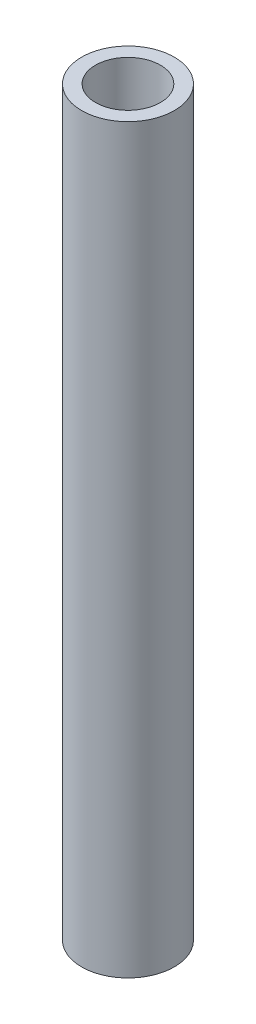
ISO-10303-21;
HEADER;
FILE_DESCRIPTION(('STEP AP214'),'2;1');
FILE_NAME('part.step','',(''),(''),'','','');
FILE_SCHEMA(('AUTOMOTIVE_DESIGN { 1 0 10303 214 1 1 1 1 }'));
ENDSEC;
DATA;
#1=APPLICATION_CONTEXT('core data for automotive mechanical design processes');
#2=APPLICATION_PROTOCOL_DEFINITION('international standard','automotive_design',2000,#1);
#3=PRODUCT_CONTEXT('',#1,'mechanical');
#4=PRODUCT('Part','Part','',(#3));
#5=PRODUCT_RELATED_PRODUCT_CATEGORY('part','',(#4));
#6=PRODUCT_DEFINITION_FORMATION('','',#4);
#7=PRODUCT_DEFINITION_CONTEXT('part definition',#1,'design');
#8=PRODUCT_DEFINITION('design','',#6,#7);
#9=PRODUCT_DEFINITION_SHAPE('','',#8);
#10=(LENGTH_UNIT() NAMED_UNIT(*) SI_UNIT(.MILLI.,.METRE.));
#11=(NAMED_UNIT(*) PLANE_ANGLE_UNIT() SI_UNIT($,.RADIAN.));
#12=(NAMED_UNIT(*) SI_UNIT($,.STERADIAN.) SOLID_ANGLE_UNIT());
#13=UNCERTAINTY_MEASURE_WITH_UNIT(LENGTH_MEASURE(1.E-05),#10,'distance_accuracy_value','');
#14=(GEOMETRIC_REPRESENTATION_CONTEXT(3) GLOBAL_UNCERTAINTY_ASSIGNED_CONTEXT((#13)) GLOBAL_UNIT_ASSIGNED_CONTEXT((#10,
#11,#12)) REPRESENTATION_CONTEXT('',''));
#15=CARTESIAN_POINT('',(0.,0.,0.));
#16=DIRECTION('',(0.,0.,1.));
#17=DIRECTION('',(1.,0.,0.));
#18=AXIS2_PLACEMENT_3D('',#15,#16,#17);
#19=CARTESIAN_POINT('',(0.,400.,0.));
#20=DIRECTION('',(0.,1.,0.));
#21=DIRECTION('',(0.,0.,1.));
#22=AXIS2_PLACEMENT_3D('',#19,#20,#21);
#23=PLANE('',#22);
#24=CARTESIAN_POINT('',(0.,400.,0.));
#25=DIRECTION('',(0.,1.,0.));
#26=DIRECTION('',(0.,0.,1.));
#27=AXIS2_PLACEMENT_3D('',#24,#25,#26);
#28=CIRCLE('',#27,50.);
#29=CARTESIAN_POINT('',(0.,400.,50.));
#30=VERTEX_POINT('',#29);
#31=EDGE_CURVE('E10',#30,#30,#28,.T.);
#32=ORIENTED_EDGE('',*,*,#31,.T.);
#33=EDGE_LOOP('',(#32));
#34=FACE_BOUND('',#33,.T.);
#35=CARTESIAN_POINT('',(0.,400.,0.));
#36=DIRECTION('',(0.,1.,0.));
#37=DIRECTION('',(0.,0.,1.));
#38=AXIS2_PLACEMENT_3D('',#35,#36,#37);
#39=CIRCLE('',#38,35.);
#40=CARTESIAN_POINT('',(0.,400.,35.));
#41=VERTEX_POINT('',#40);
#42=EDGE_CURVE('E42',#41,#41,#39,.T.);
#43=ORIENTED_EDGE('',*,*,#42,.F.);
#44=EDGE_LOOP('',(#43));
#45=FACE_BOUND('',#44,.T.);
#46=ADVANCED_FACE('F31',(#34,#45),#23,.T.);
#47=CARTESIAN_POINT('',(0.,-400.,0.));
#48=DIRECTION('',(0.,1.,0.));
#49=DIRECTION('',(0.,0.,1.));
#50=AXIS2_PLACEMENT_3D('',#47,#48,#49);
#51=PLANE('',#50);
#52=CARTESIAN_POINT('',(0.,-400.,0.));
#53=DIRECTION('',(0.,1.,0.));
#54=DIRECTION('',(0.,0.,1.));
#55=AXIS2_PLACEMENT_3D('',#52,#53,#54);
#56=CIRCLE('',#55,50.);
#57=CARTESIAN_POINT('',(0.,-400.,50.));
#58=VERTEX_POINT('',#57);
#59=EDGE_CURVE('E35',#58,#58,#56,.T.);
#60=ORIENTED_EDGE('',*,*,#59,.F.);
#61=EDGE_LOOP('',(#60));
#62=FACE_BOUND('',#61,.T.);
#63=CARTESIAN_POINT('',(0.,-400.,0.));
#64=DIRECTION('',(0.,1.,0.));
#65=DIRECTION('',(0.,0.,1.));
#66=AXIS2_PLACEMENT_3D('',#63,#64,#65);
#67=CIRCLE('',#66,35.);
#68=CARTESIAN_POINT('',(0.,-400.,35.));
#69=VERTEX_POINT('',#68);
#70=EDGE_CURVE('E44',#69,#69,#67,.T.);
#71=ORIENTED_EDGE('',*,*,#70,.T.);
#72=EDGE_LOOP('',(#71));
#73=FACE_BOUND('',#72,.T.);
#74=ADVANCED_FACE('F54',(#62,#73),#51,.F.);
#75=CARTESIAN_POINT('',(0.,400.,0.));
#76=DIRECTION('',(0.,-1.,0.));
#77=DIRECTION('',(0.,0.,-1.));
#78=AXIS2_PLACEMENT_3D('',#75,#76,#77);
#79=CYLINDRICAL_SURFACE('',#78,50.);
#80=ORIENTED_EDGE('',*,*,#31,.F.);
#81=EDGE_LOOP('',(#80));
#82=FACE_BOUND('',#81,.T.);
#83=ORIENTED_EDGE('',*,*,#59,.T.);
#84=EDGE_LOOP('',(#83));
#85=FACE_BOUND('',#84,.T.);
#86=ADVANCED_FACE('F33',(#82,#85),#79,.T.);
#87=CARTESIAN_POINT('',(0.,400.,0.));
#88=DIRECTION('',(0.,-1.,0.));
#89=DIRECTION('',(0.,0.,-1.));
#90=AXIS2_PLACEMENT_3D('',#87,#88,#89);
#91=CYLINDRICAL_SURFACE('',#90,35.);
#92=ORIENTED_EDGE('',*,*,#42,.T.);
#93=EDGE_LOOP('',(#92));
#94=FACE_BOUND('',#93,.T.);
#95=ORIENTED_EDGE('',*,*,#70,.F.);
#96=EDGE_LOOP('',(#95));
#97=FACE_BOUND('',#96,.T.);
#98=ADVANCED_FACE('F50',(#94,#97),#91,.F.);
#99=CLOSED_SHELL('',(#46,#74,#86,#98));
#100=MANIFOLD_SOLID_BREP('B2',#99);
#101=ADVANCED_BREP_SHAPE_REPRESENTATION('',(#18,#100),#14);
#102=SHAPE_DEFINITION_REPRESENTATION(#9,#101);
ENDSEC;
END-ISO-10303-21;
